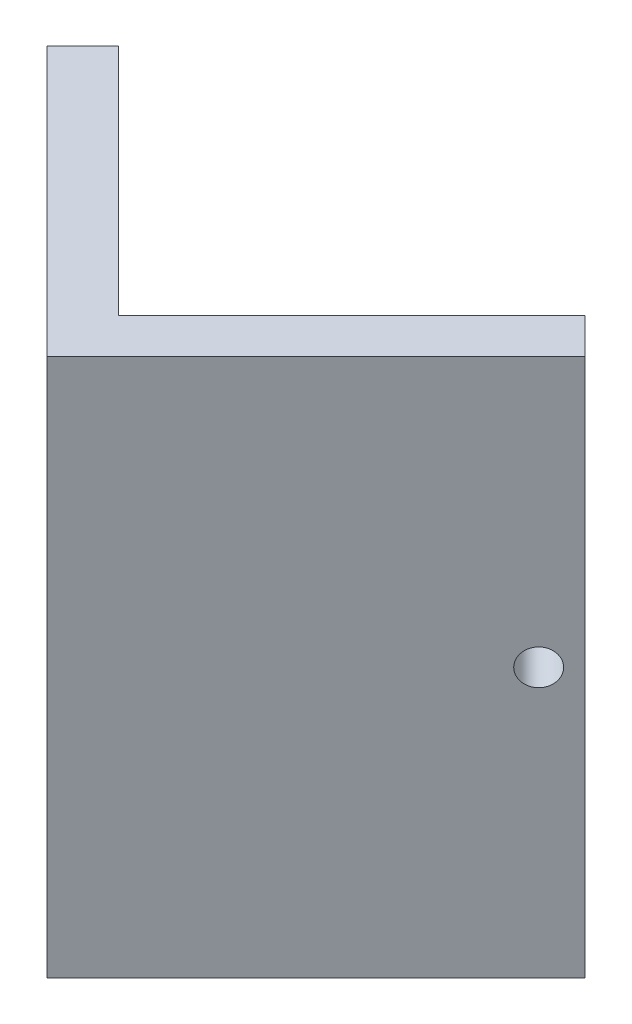
ISO-10303-21;
HEADER;
FILE_DESCRIPTION(('STEP AP214'),'2;1');
FILE_NAME('part.step','',(''),(''),'','','');
FILE_SCHEMA(('AUTOMOTIVE_DESIGN { 1 0 10303 214 1 1 1 1 }'));
ENDSEC;
DATA;
#1=APPLICATION_CONTEXT('core data for automotive mechanical design processes');
#2=APPLICATION_PROTOCOL_DEFINITION('international standard','automotive_design',2000,#1);
#3=PRODUCT_CONTEXT('',#1,'mechanical');
#4=PRODUCT('Part','Part','',(#3));
#5=PRODUCT_RELATED_PRODUCT_CATEGORY('part','',(#4));
#6=PRODUCT_DEFINITION_FORMATION('','',#4);
#7=PRODUCT_DEFINITION_CONTEXT('part definition',#1,'design');
#8=PRODUCT_DEFINITION('design','',#6,#7);
#9=PRODUCT_DEFINITION_SHAPE('','',#8);
#10=(LENGTH_UNIT() NAMED_UNIT(*) SI_UNIT(.MILLI.,.METRE.));
#11=(NAMED_UNIT(*) PLANE_ANGLE_UNIT() SI_UNIT($,.RADIAN.));
#12=(NAMED_UNIT(*) SI_UNIT($,.STERADIAN.) SOLID_ANGLE_UNIT());
#13=UNCERTAINTY_MEASURE_WITH_UNIT(LENGTH_MEASURE(1.E-05),#10,'distance_accuracy_value','');
#14=(GEOMETRIC_REPRESENTATION_CONTEXT(3) GLOBAL_UNCERTAINTY_ASSIGNED_CONTEXT((#13)) GLOBAL_UNIT_ASSIGNED_CONTEXT((#10,
#11,#12)) REPRESENTATION_CONTEXT('',''));
#15=CARTESIAN_POINT('',(0.,0.,0.));
#16=DIRECTION('',(0.,0.,1.));
#17=DIRECTION('',(1.,0.,0.));
#18=AXIS2_PLACEMENT_3D('',#15,#16,#17);
#19=CARTESIAN_POINT('',(-2.12132034355962,32.,2.12132034355966));
#20=DIRECTION('',(0.707106781186541,0.,-0.707106781186554));
#21=DIRECTION('',(-0.707106781186554,0.,-0.707106781186541));
#22=AXIS2_PLACEMENT_3D('',#19,#20,#21);
#23=PLANE('',#22);
#24=CARTESIAN_POINT('',(-14.6211417766863,16.,-10.3785010895668));
#25=DIRECTION('',(0.707106781186541,0.,-0.707106781186554));
#26=DIRECTION('',(-0.707106781186554,0.,-0.707106781186541));
#27=AXIS2_PLACEMENT_3D('',#24,#25,#26);
#28=CIRCLE('',#27,1.05);
#29=CARTESIAN_POINT('',(-15.3636038969321,16.,-11.1209632098126));
#30=VERTEX_POINT('',#29);
#31=EDGE_CURVE('E123',#30,#30,#28,.T.);
#32=ORIENTED_EDGE('',*,*,#31,.T.);
#33=EDGE_LOOP('',(#32));
#34=FACE_BOUND('',#33,.T.);
#35=DIRECTION('',(0.707106781186554,0.,0.707106781186541));
#36=VECTOR('',#35,1.);
#37=CARTESIAN_POINT('',(-2.12132034355962,0.,2.12132034355966));
#38=LINE('',#37,#36);
#39=CARTESIAN_POINT('',(-16.0000000000001,0.,-11.7573593128805));
#40=VERTEX_POINT('',#39);
#41=CARTESIAN_POINT('',(1.6826817716975E-13,0.,4.24264068711941));
#42=VERTEX_POINT('',#41);
#43=EDGE_CURVE('E119',#40,#42,#38,.T.);
#44=ORIENTED_EDGE('',*,*,#43,.T.);
#45=DIRECTION('',(0.,-1.,0.));
#46=VECTOR('',#45,1.);
#47=CARTESIAN_POINT('',(1.6826817716975E-13,32.,4.24264068711941));
#48=LINE('',#47,#46);
#49=CARTESIAN_POINT('',(1.6826817716975E-13,32.,4.24264068711941));
#50=VERTEX_POINT('',#49);
#51=EDGE_CURVE('E11',#50,#42,#48,.T.);
#52=ORIENTED_EDGE('',*,*,#51,.F.);
#53=DIRECTION('',(0.707106781186554,0.,0.707106781186541));
#54=VECTOR('',#53,1.);
#55=CARTESIAN_POINT('',(-2.12132034355962,32.,2.12132034355966));
#56=LINE('',#55,#54);
#57=CARTESIAN_POINT('',(-16.0000000000001,32.,-11.7573593128805));
#58=VERTEX_POINT('',#57);
#59=EDGE_CURVE('E132',#58,#50,#56,.T.);
#60=ORIENTED_EDGE('',*,*,#59,.F.);
#61=DIRECTION('',(0.,-1.,0.));
#62=VECTOR('',#61,1.);
#63=CARTESIAN_POINT('',(-16.0000000000001,32.,-11.7573593128805));
#64=LINE('',#63,#62);
#65=EDGE_CURVE('E118',#58,#40,#64,.T.);
#66=ORIENTED_EDGE('',*,*,#65,.T.);
#67=EDGE_LOOP('',(#44,#52,#60,#66));
#68=FACE_BOUND('',#67,.T.);
#69=ADVANCED_FACE('F35',(#34,#68),#23,.F.);
#70=CARTESIAN_POINT('',(2.12132034355979,32.,2.12132034355975));
#71=DIRECTION('',(-0.707106781186554,0.,-0.707106781186541));
#72=DIRECTION('',(-0.707106781186541,0.,0.707106781186554));
#73=AXIS2_PLACEMENT_3D('',#70,#71,#72);
#74=PLANE('',#73);
#75=CARTESIAN_POINT('',(14.6211417766862,16.,-10.3785010895669));
#76=DIRECTION('',(-0.707106781186554,0.,-0.707106781186541));
#77=DIRECTION('',(-0.707106781186541,0.,0.707106781186554));
#78=AXIS2_PLACEMENT_3D('',#75,#76,#77);
#79=CIRCLE('',#78,1.05);
#80=CARTESIAN_POINT('',(13.8786796564403,16.,-9.636038969321));
#81=VERTEX_POINT('',#80);
#82=EDGE_CURVE('E168',#81,#81,#79,.T.);
#83=ORIENTED_EDGE('',*,*,#82,.T.);
#84=EDGE_LOOP('',(#83));
#85=FACE_BOUND('',#84,.T.);
#86=DIRECTION('',(0.707106781186541,0.,-0.707106781186554));
#87=VECTOR('',#86,1.);
#88=CARTESIAN_POINT('',(2.12132034355979,0.,2.12132034355975));
#89=LINE('',#88,#87);
#90=CARTESIAN_POINT('',(15.9999999999999,0.,-11.7573593128807));
#91=VERTEX_POINT('',#90);
#92=EDGE_CURVE('E122',#42,#91,#89,.T.);
#93=ORIENTED_EDGE('',*,*,#92,.T.);
#94=DIRECTION('',(0.,-1.,0.));
#95=VECTOR('',#94,1.);
#96=CARTESIAN_POINT('',(15.9999999999999,32.,-11.7573593128807));
#97=LINE('',#96,#95);
#98=CARTESIAN_POINT('',(15.9999999999999,32.,-11.7573593128807));
#99=VERTEX_POINT('',#98);
#100=EDGE_CURVE('E43',#99,#91,#97,.T.);
#101=ORIENTED_EDGE('',*,*,#100,.F.);
#102=DIRECTION('',(0.707106781186541,0.,-0.707106781186554));
#103=VECTOR('',#102,1.);
#104=CARTESIAN_POINT('',(2.12132034355979,32.,2.12132034355975));
#105=LINE('',#104,#103);
#106=EDGE_CURVE('E87',#50,#99,#105,.T.);
#107=ORIENTED_EDGE('',*,*,#106,.F.);
#108=ORIENTED_EDGE('',*,*,#51,.T.);
#109=EDGE_LOOP('',(#93,#101,#107,#108));
#110=FACE_BOUND('',#109,.T.);
#111=ADVANCED_FACE('F138',(#85,#110),#74,.F.);
#112=CARTESIAN_POINT('',(13.8786796564403,32.,-13.8786796564403));
#113=DIRECTION('',(0.707106781186549,0.,-0.707106781186546));
#114=DIRECTION('',(-0.707106781186546,0.,-0.707106781186549));
#115=AXIS2_PLACEMENT_3D('',#112,#113,#114);
#116=PLANE('',#115);
#117=DIRECTION('',(0.707106781186546,0.,0.707106781186549));
#118=VECTOR('',#117,1.);
#119=CARTESIAN_POINT('',(13.8786796564403,0.,-13.8786796564403));
#120=LINE('',#119,#118);
#121=CARTESIAN_POINT('',(13.8786796564403,0.,-13.8786796564403));
#122=VERTEX_POINT('',#121);
#123=EDGE_CURVE('E126',#122,#91,#120,.T.);
#124=ORIENTED_EDGE('',*,*,#123,.F.);
#125=DIRECTION('',(0.,-1.,0.));
#126=VECTOR('',#125,1.);
#127=CARTESIAN_POINT('',(13.8786796564403,32.,-13.8786796564403));
#128=LINE('',#127,#126);
#129=CARTESIAN_POINT('',(13.8786796564403,32.,-13.8786796564403));
#130=VERTEX_POINT('',#129);
#131=EDGE_CURVE('E103',#130,#122,#128,.T.);
#132=ORIENTED_EDGE('',*,*,#131,.F.);
#133=DIRECTION('',(0.707106781186546,0.,0.707106781186549));
#134=VECTOR('',#133,1.);
#135=CARTESIAN_POINT('',(13.8786796564403,32.,-13.8786796564403));
#136=LINE('',#135,#134);
#137=EDGE_CURVE('E112',#130,#99,#136,.T.);
#138=ORIENTED_EDGE('',*,*,#137,.T.);
#139=ORIENTED_EDGE('',*,*,#100,.T.);
#140=EDGE_LOOP('',(#124,#132,#138,#139));
#141=FACE_BOUND('',#140,.T.);
#142=ADVANCED_FACE('F137',(#141),#116,.T.);
#143=CARTESIAN_POINT('',(0.,32.,0.));
#144=DIRECTION('',(-0.707106781186547,0.,-0.707106781186547));
#145=DIRECTION('',(-0.707106781186548,0.,0.707106781186548));
#146=AXIS2_PLACEMENT_3D('',#143,#144,#145);
#147=PLANE('',#146);
#148=CARTESIAN_POINT('',(12.4998214331265,16.,-12.4998214331265));
#149=DIRECTION('',(-0.707106781186548,0.,-0.707106781186547));
#150=DIRECTION('',(-0.707106781186547,0.,0.707106781186548));
#151=AXIS2_PLACEMENT_3D('',#148,#149,#150);
#152=CIRCLE('',#151,1.05);
#153=CARTESIAN_POINT('',(11.7573593128807,16.,-11.7573593128807));
#154=VERTEX_POINT('',#153);
#155=EDGE_CURVE('E174',#154,#154,#152,.T.);
#156=ORIENTED_EDGE('',*,*,#155,.F.);
#157=EDGE_LOOP('',(#156));
#158=FACE_BOUND('',#157,.T.);
#159=DIRECTION('',(0.707106781186548,0.,-0.707106781186548));
#160=VECTOR('',#159,1.);
#161=CARTESIAN_POINT('',(0.,0.,0.));
#162=LINE('',#161,#160);
#163=CARTESIAN_POINT('',(0.,0.,0.));
#164=VERTEX_POINT('',#163);
#165=EDGE_CURVE('E102',#164,#122,#162,.T.);
#166=ORIENTED_EDGE('',*,*,#165,.F.);
#167=DIRECTION('',(0.,-1.,0.));
#168=VECTOR('',#167,1.);
#169=CARTESIAN_POINT('',(0.,32.,0.));
#170=LINE('',#169,#168);
#171=CARTESIAN_POINT('',(0.,32.,0.));
#172=VERTEX_POINT('',#171);
#173=EDGE_CURVE('E96',#172,#164,#170,.T.);
#174=ORIENTED_EDGE('',*,*,#173,.F.);
#175=DIRECTION('',(0.707106781186548,0.,-0.707106781186548));
#176=VECTOR('',#175,1.);
#177=CARTESIAN_POINT('',(0.,32.,0.));
#178=LINE('',#177,#176);
#179=EDGE_CURVE('E100',#172,#130,#178,.T.);
#180=ORIENTED_EDGE('',*,*,#179,.T.);
#181=ORIENTED_EDGE('',*,*,#131,.T.);
#182=EDGE_LOOP('',(#166,#174,#180,#181));
#183=FACE_BOUND('',#182,.T.);
#184=ADVANCED_FACE('F98',(#158,#183),#147,.T.);
#185=CARTESIAN_POINT('',(0.,32.,0.));
#186=DIRECTION('',(-0.707106781186541,0.,0.707106781186554));
#187=DIRECTION('',(0.707106781186554,0.,0.707106781186541));
#188=AXIS2_PLACEMENT_3D('',#185,#186,#187);
#189=PLANE('',#188);
#190=CARTESIAN_POINT('',(-12.4998214331266,16.,-12.4998214331264));
#191=DIRECTION('',(0.707106781186541,0.,-0.707106781186554));
#192=DIRECTION('',(-0.707106781186554,0.,-0.707106781186541));
#193=AXIS2_PLACEMENT_3D('',#190,#191,#192);
#194=CIRCLE('',#193,1.05);
#195=CARTESIAN_POINT('',(-13.2422835533725,16.,-13.2422835533723));
#196=VERTEX_POINT('',#195);
#197=EDGE_CURVE('E165',#196,#196,#194,.T.);
#198=ORIENTED_EDGE('',*,*,#197,.F.);
#199=EDGE_LOOP('',(#198));
#200=FACE_BOUND('',#199,.T.);
#201=DIRECTION('',(-0.707106781186554,0.,-0.707106781186541));
#202=VECTOR('',#201,1.);
#203=CARTESIAN_POINT('',(0.,0.,0.));
#204=LINE('',#203,#202);
#205=CARTESIAN_POINT('',(-13.8786796564404,0.,-13.8786796564402));
#206=VERTEX_POINT('',#205);
#207=EDGE_CURVE('E73',#164,#206,#204,.T.);
#208=ORIENTED_EDGE('',*,*,#207,.T.);
#209=DIRECTION('',(0.,-1.,0.));
#210=VECTOR('',#209,1.);
#211=CARTESIAN_POINT('',(-13.8786796564404,32.,-13.8786796564402));
#212=LINE('',#211,#210);
#213=CARTESIAN_POINT('',(-13.8786796564404,32.,-13.8786796564402));
#214=VERTEX_POINT('',#213);
#215=EDGE_CURVE('E104',#214,#206,#212,.T.);
#216=ORIENTED_EDGE('',*,*,#215,.F.);
#217=DIRECTION('',(-0.707106781186554,0.,-0.707106781186541));
#218=VECTOR('',#217,1.);
#219=CARTESIAN_POINT('',(0.,32.,0.));
#220=LINE('',#219,#218);
#221=EDGE_CURVE('E106',#172,#214,#220,.T.);
#222=ORIENTED_EDGE('',*,*,#221,.F.);
#223=ORIENTED_EDGE('',*,*,#173,.T.);
#224=EDGE_LOOP('',(#208,#216,#222,#223));
#225=FACE_BOUND('',#224,.T.);
#226=ADVANCED_FACE('F107',(#200,#225),#189,.F.);
#227=CARTESIAN_POINT('',(-13.8786796564404,32.,-13.8786796564402));
#228=DIRECTION('',(0.707106781186553,0.,0.707106781186542));
#229=DIRECTION('',(0.707106781186542,0.,-0.707106781186553));
#230=AXIS2_PLACEMENT_3D('',#227,#228,#229);
#231=PLANE('',#230);
#232=DIRECTION('',(-0.707106781186542,0.,0.707106781186553));
#233=VECTOR('',#232,1.);
#234=CARTESIAN_POINT('',(-13.8786796564404,0.,-13.8786796564402));
#235=LINE('',#234,#233);
#236=EDGE_CURVE('E79',#206,#40,#235,.T.);
#237=ORIENTED_EDGE('',*,*,#236,.T.);
#238=ORIENTED_EDGE('',*,*,#65,.F.);
#239=DIRECTION('',(-0.707106781186542,0.,0.707106781186553));
#240=VECTOR('',#239,1.);
#241=CARTESIAN_POINT('',(-13.8786796564404,32.,-13.8786796564402));
#242=LINE('',#241,#240);
#243=EDGE_CURVE('E51',#214,#58,#242,.T.);
#244=ORIENTED_EDGE('',*,*,#243,.F.);
#245=ORIENTED_EDGE('',*,*,#215,.T.);
#246=EDGE_LOOP('',(#237,#238,#244,#245));
#247=FACE_BOUND('',#246,.T.);
#248=ADVANCED_FACE('F145',(#247),#231,.F.);
#249=CARTESIAN_POINT('',(0.,32.,0.));
#250=DIRECTION('',(0.,1.,0.));
#251=DIRECTION('',(0.,0.,1.));
#252=AXIS2_PLACEMENT_3D('',#249,#250,#251);
#253=PLANE('',#252);
#254=ORIENTED_EDGE('',*,*,#59,.T.);
#255=ORIENTED_EDGE('',*,*,#106,.T.);
#256=ORIENTED_EDGE('',*,*,#137,.F.);
#257=ORIENTED_EDGE('',*,*,#179,.F.);
#258=ORIENTED_EDGE('',*,*,#221,.T.);
#259=ORIENTED_EDGE('',*,*,#243,.T.);
#260=EDGE_LOOP('',(#254,#255,#256,#257,#258,#259));
#261=FACE_BOUND('',#260,.T.);
#262=ADVANCED_FACE('F110',(#261),#253,.T.);
#263=CARTESIAN_POINT('',(0.,0.,0.));
#264=DIRECTION('',(0.,1.,0.));
#265=DIRECTION('',(0.,0.,1.));
#266=AXIS2_PLACEMENT_3D('',#263,#264,#265);
#267=PLANE('',#266);
#268=ORIENTED_EDGE('',*,*,#43,.F.);
#269=ORIENTED_EDGE('',*,*,#236,.F.);
#270=ORIENTED_EDGE('',*,*,#207,.F.);
#271=ORIENTED_EDGE('',*,*,#165,.T.);
#272=ORIENTED_EDGE('',*,*,#123,.T.);
#273=ORIENTED_EDGE('',*,*,#92,.F.);
#274=EDGE_LOOP('',(#268,#269,#270,#271,#272,#273));
#275=FACE_BOUND('',#274,.T.);
#276=ADVANCED_FACE('F142',(#275),#267,.F.);
#277=CARTESIAN_POINT('',(-35.127238431096,16.,10.1275955648433));
#278=DIRECTION('',(0.707106781186541,0.,-0.707106781186554));
#279=DIRECTION('',(-0.707106781186554,0.,-0.707106781186541));
#280=AXIS2_PLACEMENT_3D('',#277,#278,#279);
#281=CYLINDRICAL_SURFACE('',#280,1.05);
#282=ORIENTED_EDGE('',*,*,#197,.T.);
#283=EDGE_LOOP('',(#282));
#284=FACE_BOUND('',#283,.T.);
#285=ORIENTED_EDGE('',*,*,#31,.F.);
#286=EDGE_LOOP('',(#285));
#287=FACE_BOUND('',#286,.T.);
#288=ADVANCED_FACE('F199',(#284,#287),#281,.F.);
#289=CARTESIAN_POINT('',(35.1272384310961,16.,10.127595564843));
#290=DIRECTION('',(-0.707106781186548,0.,-0.707106781186547));
#291=DIRECTION('',(-0.707106781186547,0.,0.707106781186548));
#292=AXIS2_PLACEMENT_3D('',#289,#290,#291);
#293=CYLINDRICAL_SURFACE('',#292,1.05);
#294=ORIENTED_EDGE('',*,*,#155,.T.);
#295=EDGE_LOOP('',(#294));
#296=FACE_BOUND('',#295,.T.);
#297=ORIENTED_EDGE('',*,*,#82,.F.);
#298=EDGE_LOOP('',(#297));
#299=FACE_BOUND('',#298,.T.);
#300=ADVANCED_FACE('F178',(#296,#299),#293,.F.);
#301=CLOSED_SHELL('',(#69,#111,#142,#184,#226,#248,#262,#276,#288,#300));
#302=MANIFOLD_SOLID_BREP('B2',#301);
#303=ADVANCED_BREP_SHAPE_REPRESENTATION('',(#18,#302),#14);
#304=SHAPE_DEFINITION_REPRESENTATION(#9,#303);
ENDSEC;
END-ISO-10303-21;
